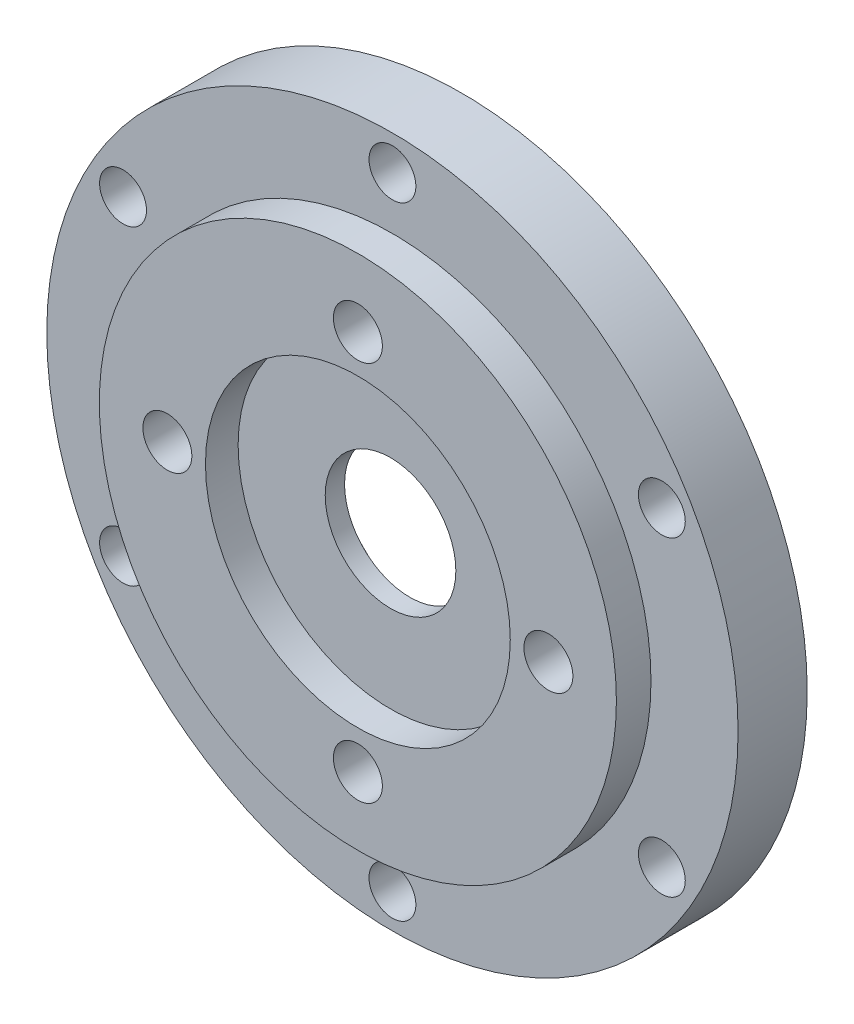
ISO-10303-21;
HEADER;
FILE_DESCRIPTION(('STEP AP214'),'2;1');
FILE_NAME('part.step','',(''),(''),'','','');
FILE_SCHEMA(('AUTOMOTIVE_DESIGN { 1 0 10303 214 1 1 1 1 }'));
ENDSEC;
DATA;
#1=APPLICATION_CONTEXT('core data for automotive mechanical design processes');
#2=APPLICATION_PROTOCOL_DEFINITION('international standard','automotive_design',2000,#1);
#3=PRODUCT_CONTEXT('',#1,'mechanical');
#4=PRODUCT('Part','Part','',(#3));
#5=PRODUCT_RELATED_PRODUCT_CATEGORY('part','',(#4));
#6=PRODUCT_DEFINITION_FORMATION('','',#4);
#7=PRODUCT_DEFINITION_CONTEXT('part definition',#1,'design');
#8=PRODUCT_DEFINITION('design','',#6,#7);
#9=PRODUCT_DEFINITION_SHAPE('','',#8);
#10=(LENGTH_UNIT() NAMED_UNIT(*) SI_UNIT(.MILLI.,.METRE.));
#11=(NAMED_UNIT(*) PLANE_ANGLE_UNIT() SI_UNIT($,.RADIAN.));
#12=(NAMED_UNIT(*) SI_UNIT($,.STERADIAN.) SOLID_ANGLE_UNIT());
#13=UNCERTAINTY_MEASURE_WITH_UNIT(LENGTH_MEASURE(1.E-05),#10,'distance_accuracy_value','');
#14=(GEOMETRIC_REPRESENTATION_CONTEXT(3) GLOBAL_UNCERTAINTY_ASSIGNED_CONTEXT((#13)) GLOBAL_UNIT_ASSIGNED_CONTEXT((#10,
#11,#12)) REPRESENTATION_CONTEXT('',''));
#15=CARTESIAN_POINT('',(0.,0.,0.));
#16=DIRECTION('',(0.,0.,1.));
#17=DIRECTION('',(1.,0.,0.));
#18=AXIS2_PLACEMENT_3D('',#15,#16,#17);
#19=CARTESIAN_POINT('',(0.,0.,9.525));
#20=DIRECTION('',(0.,0.,-1.));
#21=DIRECTION('',(-1.,0.,0.));
#22=AXIS2_PLACEMENT_3D('',#19,#20,#21);
#23=CYLINDRICAL_SURFACE('',#22,31.75);
#24=CARTESIAN_POINT('',(0.,0.,0.));
#25=DIRECTION('',(0.,0.,1.));
#26=DIRECTION('',(1.,0.,0.));
#27=AXIS2_PLACEMENT_3D('',#24,#25,#26);
#28=CIRCLE('',#27,31.75);
#29=CARTESIAN_POINT('',(-31.75,0.,0.));
#30=VERTEX_POINT('',#29);
#31=EDGE_CURVE('E11',#30,#30,#28,.T.);
#32=CARTESIAN_POINT('',(0.,0.,6.35));
#33=DIRECTION('',(0.,0.,1.));
#34=DIRECTION('',(1.,0.,0.));
#35=AXIS2_PLACEMENT_3D('',#32,#33,#34);
#36=CIRCLE('',#35,31.75);
#37=CARTESIAN_POINT('',(-31.75,0.,6.35));
#38=VERTEX_POINT('',#37);
#39=EDGE_CURVE('E125',#38,#38,#36,.T.);
#40=CARTESIAN_POINT('',(-31.75,0.,0.));
#41=CARTESIAN_POINT('',(-31.75,0.,0.0661458333333336));
#42=CARTESIAN_POINT('',(-31.75,0.,0.132291666666667));
#43=CARTESIAN_POINT('',(-31.75,0.,0.264583333333334));
#44=CARTESIAN_POINT('',(-31.75,0.,0.330729166666667));
#45=CARTESIAN_POINT('',(-31.75,0.,0.463020833333333));
#46=CARTESIAN_POINT('',(-31.75,0.,0.529166666666667));
#47=CARTESIAN_POINT('',(-31.75,0.,0.661458333333333));
#48=CARTESIAN_POINT('',(-31.75,0.,0.727604166666666));
#49=CARTESIAN_POINT('',(-31.75,0.,0.859895833333333));
#50=CARTESIAN_POINT('',(-31.75,0.,0.926041666666666));
#51=CARTESIAN_POINT('',(-31.75,0.,1.05833333333333));
#52=CARTESIAN_POINT('',(-31.75,0.,1.12447916666667));
#53=CARTESIAN_POINT('',(-31.75,0.,1.25677083333333));
#54=CARTESIAN_POINT('',(-31.75,0.,1.32291666666667));
#55=CARTESIAN_POINT('',(-31.75,0.,1.45520833333333));
#56=CARTESIAN_POINT('',(-31.75,0.,1.52135416666667));
#57=CARTESIAN_POINT('',(-31.75,0.,1.65364583333333));
#58=CARTESIAN_POINT('',(-31.75,0.,1.71979166666667));
#59=CARTESIAN_POINT('',(-31.75,0.,1.85208333333333));
#60=CARTESIAN_POINT('',(-31.75,0.,1.91822916666667));
#61=CARTESIAN_POINT('',(-31.75,0.,2.05052083333333));
#62=CARTESIAN_POINT('',(-31.75,0.,2.11666666666667));
#63=CARTESIAN_POINT('',(-31.75,0.,2.24895833333333));
#64=CARTESIAN_POINT('',(-31.75,0.,2.31510416666667));
#65=CARTESIAN_POINT('',(-31.75,0.,2.44739583333333));
#66=CARTESIAN_POINT('',(-31.75,0.,2.51354166666667));
#67=CARTESIAN_POINT('',(-31.75,0.,2.64583333333333));
#68=CARTESIAN_POINT('',(-31.75,0.,2.71197916666667));
#69=CARTESIAN_POINT('',(-31.75,0.,2.84427083333333));
#70=CARTESIAN_POINT('',(-31.75,0.,2.91041666666667));
#71=CARTESIAN_POINT('',(-31.75,0.,3.04270833333333));
#72=CARTESIAN_POINT('',(-31.75,0.,3.10885416666667));
#73=CARTESIAN_POINT('',(-31.75,0.,3.24114583333333));
#74=CARTESIAN_POINT('',(-31.75,0.,3.30729166666667));
#75=CARTESIAN_POINT('',(-31.75,0.,3.43958333333333));
#76=CARTESIAN_POINT('',(-31.75,0.,3.50572916666667));
#77=CARTESIAN_POINT('',(-31.75,0.,3.63802083333333));
#78=CARTESIAN_POINT('',(-31.75,0.,3.70416666666667));
#79=CARTESIAN_POINT('',(-31.75,0.,3.83645833333333));
#80=CARTESIAN_POINT('',(-31.75,0.,3.90260416666667));
#81=CARTESIAN_POINT('',(-31.75,0.,4.03489583333333));
#82=CARTESIAN_POINT('',(-31.75,0.,4.10104166666667));
#83=CARTESIAN_POINT('',(-31.75,0.,4.23333333333333));
#84=CARTESIAN_POINT('',(-31.75,0.,4.29947916666667));
#85=CARTESIAN_POINT('',(-31.75,0.,4.43177083333333));
#86=CARTESIAN_POINT('',(-31.75,0.,4.49791666666667));
#87=CARTESIAN_POINT('',(-31.75,0.,4.63020833333333));
#88=CARTESIAN_POINT('',(-31.75,0.,4.69635416666667));
#89=CARTESIAN_POINT('',(-31.75,0.,4.82864583333333));
#90=CARTESIAN_POINT('',(-31.75,0.,4.89479166666667));
#91=CARTESIAN_POINT('',(-31.75,0.,5.02708333333333));
#92=CARTESIAN_POINT('',(-31.75,0.,5.09322916666667));
#93=CARTESIAN_POINT('',(-31.75,0.,5.22552083333333));
#94=CARTESIAN_POINT('',(-31.75,0.,5.29166666666667));
#95=CARTESIAN_POINT('',(-31.75,0.,5.42395833333333));
#96=CARTESIAN_POINT('',(-31.75,0.,5.49010416666667));
#97=CARTESIAN_POINT('',(-31.75,0.,5.62239583333333));
#98=CARTESIAN_POINT('',(-31.75,0.,5.68854166666667));
#99=CARTESIAN_POINT('',(-31.75,0.,5.82083333333333));
#100=CARTESIAN_POINT('',(-31.75,0.,5.88697916666667));
#101=CARTESIAN_POINT('',(-31.75,0.,6.01927083333333));
#102=CARTESIAN_POINT('',(-31.75,0.,6.08541666666667));
#103=CARTESIAN_POINT('',(-31.75,0.,6.21770833333333));
#104=CARTESIAN_POINT('',(-31.75,0.,6.28385416666667));
#105=CARTESIAN_POINT('',(-31.75,0.,6.35));
#106=B_SPLINE_CURVE_WITH_KNOTS('',3,(#40,#41,#42,#43,#44,#45,#46,#47,#48,#49,#50,#51,#52,#53,
#54,#55,#56,#57,#58,#59,#60,#61,#62,#63,#64,#65,#66,#67,#68,#69,#70,#71,#72,#73,#74,#75,#76,#77,
#78,#79,#80,#81,#82,#83,#84,#85,#86,#87,#88,#89,#90,#91,#92,#93,#94,#95,#96,#97,#98,#99,#100,
#101,#102,#103,#104,#105),.UNSPECIFIED.,.F.,.F.,(4,2,2,2,2,2,2,2,2,2,2,2,2,2,2,2,2,2,2,2,2,2,2,
2,2,2,2,2,2,2,2,2,4),(0.,0.198437500000001,0.396875,0.5953125,0.793749999999999,0.9921875,
1.190625,1.3890625,1.5875,1.7859375,1.984375,2.1828125,2.38125,2.5796875,2.778125,2.9765625,
3.175,3.3734375,3.571875,3.7703125,3.96875,4.1671875,4.365625,4.5640625,4.7625,4.9609375,
5.159375,5.3578125,5.55625,5.7546875,5.953125,6.1515625,6.35),.UNSPECIFIED.);
#107=EDGE_CURVE('BSEAM31',#30,#38,#106,.T.);
#108=ORIENTED_EDGE('',*,*,#31,.T.);
#109=ORIENTED_EDGE('',*,*,#39,.F.);
#110=ORIENTED_EDGE('',*,*,#107,.T.);
#111=ORIENTED_EDGE('',*,*,#107,.F.);
#112=EDGE_LOOP('',(#108,#110,#109,#111));
#113=FACE_BOUND('',#112,.T.);
#114=ADVANCED_FACE('F31',(#113),#23,.T.);
#115=CARTESIAN_POINT('',(0.,0.,9.525));
#116=DIRECTION('',(0.,0.,1.));
#117=DIRECTION('',(1.,0.,0.));
#118=AXIS2_PLACEMENT_3D('',#115,#116,#117);
#119=PLANE('',#118);
#120=CARTESIAN_POINT('',(0.,0.,9.525));
#121=DIRECTION('',(0.,0.,1.));
#122=DIRECTION('',(1.,0.,0.));
#123=AXIS2_PLACEMENT_3D('',#120,#121,#122);
#124=CIRCLE('',#123,14.);
#125=CARTESIAN_POINT('',(14.,0.,9.525));
#126=VERTEX_POINT('',#125);
#127=EDGE_CURVE('E42',#126,#126,#124,.T.);
#128=ORIENTED_EDGE('',*,*,#127,.F.);
#129=EDGE_LOOP('',(#128));
#130=FACE_BOUND('',#129,.T.);
#131=CARTESIAN_POINT('',(17.5,1.83302876458243E-13,9.525));
#132=DIRECTION('',(0.,0.,-1.));
#133=DIRECTION('',(-1.,0.,0.));
#134=AXIS2_PLACEMENT_3D('',#131,#132,#133);
#135=CIRCLE('',#134,2.25);
#136=CARTESIAN_POINT('',(15.25,1.83302876458243E-13,9.525));
#137=VERTEX_POINT('',#136);
#138=EDGE_CURVE('E77',#137,#137,#135,.T.);
#139=ORIENTED_EDGE('',*,*,#138,.T.);
#140=EDGE_LOOP('',(#139));
#141=FACE_BOUND('',#140,.T.);
#142=CARTESIAN_POINT('',(1.22201917638828E-13,-17.5,9.525));
#143=DIRECTION('',(0.,0.,-1.));
#144=DIRECTION('',(-1.,0.,0.));
#145=AXIS2_PLACEMENT_3D('',#142,#143,#144);
#146=CIRCLE('',#145,2.25);
#147=CARTESIAN_POINT('',(-2.24999999999988,-17.5,9.525));
#148=VERTEX_POINT('',#147);
#149=EDGE_CURVE('E89',#148,#148,#146,.T.);
#150=ORIENTED_EDGE('',*,*,#149,.T.);
#151=EDGE_LOOP('',(#150));
#152=FACE_BOUND('',#151,.T.);
#153=CARTESIAN_POINT('',(-17.5,0.,9.525));
#154=DIRECTION('',(0.,0.,-1.));
#155=DIRECTION('',(-1.,0.,0.));
#156=AXIS2_PLACEMENT_3D('',#153,#154,#155);
#157=CIRCLE('',#156,2.25);
#158=CARTESIAN_POINT('',(-19.75,0.,9.525));
#159=VERTEX_POINT('',#158);
#160=EDGE_CURVE('E101',#159,#159,#157,.T.);
#161=ORIENTED_EDGE('',*,*,#160,.T.);
#162=EDGE_LOOP('',(#161));
#163=FACE_BOUND('',#162,.T.);
#164=CARTESIAN_POINT('',(0.,17.5,9.525));
#165=DIRECTION('',(0.,0.,-1.));
#166=DIRECTION('',(-1.,0.,0.));
#167=AXIS2_PLACEMENT_3D('',#164,#165,#166);
#168=CIRCLE('',#167,2.25);
#169=CARTESIAN_POINT('',(-2.25,17.5,9.525));
#170=VERTEX_POINT('',#169);
#171=EDGE_CURVE('E113',#170,#170,#168,.T.);
#172=ORIENTED_EDGE('',*,*,#171,.T.);
#173=EDGE_LOOP('',(#172));
#174=FACE_BOUND('',#173,.T.);
#175=CARTESIAN_POINT('',(0.,0.,9.525));
#176=DIRECTION('',(0.,0.,1.));
#177=DIRECTION('',(1.,0.,0.));
#178=AXIS2_PLACEMENT_3D('',#175,#176,#177);
#179=CIRCLE('',#178,23.749);
#180=CARTESIAN_POINT('',(23.749,0.,9.525));
#181=VERTEX_POINT('',#180);
#182=EDGE_CURVE('E143',#181,#181,#179,.T.);
#183=ORIENTED_EDGE('',*,*,#182,.T.);
#184=EDGE_LOOP('',(#183));
#185=FACE_BOUND('',#184,.T.);
#186=ADVANCED_FACE('F174',(#130,#141,#152,#163,#174,#185),#119,.T.);
#187=CARTESIAN_POINT('',(-24.7466759131402,14.2875000000003,9.525));
#188=DIRECTION('',(0.,0.,1.));
#189=DIRECTION('',(1.,0.,0.));
#190=AXIS2_PLACEMENT_3D('',#187,#188,#189);
#191=CYLINDRICAL_SURFACE('',#190,2.15264999999999);
#192=CARTESIAN_POINT('',(-24.7466759131402,14.2875000000003,0.));
#193=DIRECTION('',(0.,0.,1.));
#194=DIRECTION('',(1.,0.,0.));
#195=AXIS2_PLACEMENT_3D('',#192,#193,#194);
#196=CIRCLE('',#195,2.15265);
#197=CARTESIAN_POINT('',(-22.5940259131402,14.2875000000003,0.));
#198=VERTEX_POINT('',#197);
#199=EDGE_CURVE('E46',#198,#198,#196,.T.);
#200=ORIENTED_EDGE('',*,*,#199,.F.);
#201=EDGE_LOOP('',(#200));
#202=FACE_BOUND('',#201,.T.);
#203=CARTESIAN_POINT('',(-24.7466759131402,14.2875000000003,6.35));
#204=DIRECTION('',(0.,0.,1.));
#205=DIRECTION('',(1.,0.,0.));
#206=AXIS2_PLACEMENT_3D('',#203,#204,#205);
#207=CIRCLE('',#206,2.15264999999999);
#208=CARTESIAN_POINT('',(-22.5940259131402,14.2875000000003,6.35));
#209=VERTEX_POINT('',#208);
#210=EDGE_CURVE('E128',#209,#209,#207,.F.);
#211=ORIENTED_EDGE('',*,*,#210,.F.);
#212=EDGE_LOOP('',(#211));
#213=FACE_BOUND('',#212,.T.);
#214=ADVANCED_FACE('F178',(#202,#213),#191,.F.);
#215=CARTESIAN_POINT('',(-24.7466759131405,-14.2874999999998,9.525));
#216=DIRECTION('',(0.,0.,1.));
#217=DIRECTION('',(1.,0.,0.));
#218=AXIS2_PLACEMENT_3D('',#215,#216,#217);
#219=CYLINDRICAL_SURFACE('',#218,2.15264999999999);
#220=CARTESIAN_POINT('',(-24.7466759131405,-14.2874999999998,0.));
#221=DIRECTION('',(0.,0.,1.));
#222=DIRECTION('',(1.,0.,0.));
#223=AXIS2_PLACEMENT_3D('',#220,#221,#222);
#224=CIRCLE('',#223,2.15265);
#225=CARTESIAN_POINT('',(-22.5940259131405,-14.2874999999998,0.));
#226=VERTEX_POINT('',#225);
#227=EDGE_CURVE('E50',#226,#226,#224,.T.);
#228=ORIENTED_EDGE('',*,*,#227,.F.);
#229=EDGE_LOOP('',(#228));
#230=FACE_BOUND('',#229,.T.);
#231=CARTESIAN_POINT('',(-24.7466759131405,-14.2874999999998,6.35));
#232=DIRECTION('',(0.,0.,1.));
#233=DIRECTION('',(1.,0.,0.));
#234=AXIS2_PLACEMENT_3D('',#231,#232,#233);
#235=CIRCLE('',#234,2.15264999999999);
#236=CARTESIAN_POINT('',(-22.5940259131405,-14.2874999999998,6.35));
#237=VERTEX_POINT('',#236);
#238=EDGE_CURVE('E131',#237,#237,#235,.F.);
#239=ORIENTED_EDGE('',*,*,#238,.F.);
#240=EDGE_LOOP('',(#239));
#241=FACE_BOUND('',#240,.T.);
#242=ADVANCED_FACE('F277',(#230,#241),#219,.F.);
#243=CARTESIAN_POINT('',(-1.99538274087401E-13,-28.575,9.525));
#244=DIRECTION('',(0.,0.,1.));
#245=DIRECTION('',(1.,0.,0.));
#246=AXIS2_PLACEMENT_3D('',#243,#244,#245);
#247=CYLINDRICAL_SURFACE('',#246,2.15264999999999);
#248=CARTESIAN_POINT('',(-1.99538274087401E-13,-28.575,0.));
#249=DIRECTION('',(0.,0.,1.));
#250=DIRECTION('',(1.,0.,0.));
#251=AXIS2_PLACEMENT_3D('',#248,#249,#250);
#252=CIRCLE('',#251,2.15265);
#253=CARTESIAN_POINT('',(2.1526499999998,-28.575,0.));
#254=VERTEX_POINT('',#253);
#255=EDGE_CURVE('E53',#254,#254,#252,.T.);
#256=ORIENTED_EDGE('',*,*,#255,.F.);
#257=EDGE_LOOP('',(#256));
#258=FACE_BOUND('',#257,.T.);
#259=CARTESIAN_POINT('',(-1.99538274087401E-13,-28.575,6.35));
#260=DIRECTION('',(0.,0.,1.));
#261=DIRECTION('',(1.,0.,0.));
#262=AXIS2_PLACEMENT_3D('',#259,#260,#261);
#263=CIRCLE('',#262,2.15264999999999);
#264=CARTESIAN_POINT('',(2.15264999999979,-28.575,6.35));
#265=VERTEX_POINT('',#264);
#266=EDGE_CURVE('E134',#265,#265,#263,.F.);
#267=ORIENTED_EDGE('',*,*,#266,.F.);
#268=EDGE_LOOP('',(#267));
#269=FACE_BOUND('',#268,.T.);
#270=ADVANCED_FACE('F283',(#258,#269),#247,.F.);
#271=CARTESIAN_POINT('',(24.7466759131403,-14.2875000000001,9.525));
#272=DIRECTION('',(0.,0.,1.));
#273=DIRECTION('',(1.,0.,0.));
#274=AXIS2_PLACEMENT_3D('',#271,#272,#273);
#275=CYLINDRICAL_SURFACE('',#274,2.15264999999999);
#276=CARTESIAN_POINT('',(24.7466759131403,-14.2875000000001,0.));
#277=DIRECTION('',(0.,0.,1.));
#278=DIRECTION('',(1.,0.,0.));
#279=AXIS2_PLACEMENT_3D('',#276,#277,#278);
#280=CIRCLE('',#279,2.15265);
#281=CARTESIAN_POINT('',(26.8993259131403,-14.2875000000001,0.));
#282=VERTEX_POINT('',#281);
#283=EDGE_CURVE('E56',#282,#282,#280,.T.);
#284=ORIENTED_EDGE('',*,*,#283,.F.);
#285=EDGE_LOOP('',(#284));
#286=FACE_BOUND('',#285,.T.);
#287=CARTESIAN_POINT('',(24.7466759131403,-14.2875000000001,6.35));
#288=DIRECTION('',(0.,0.,1.));
#289=DIRECTION('',(1.,0.,0.));
#290=AXIS2_PLACEMENT_3D('',#287,#288,#289);
#291=CIRCLE('',#290,2.15264999999999);
#292=CARTESIAN_POINT('',(26.8993259131403,-14.2875000000001,6.35));
#293=VERTEX_POINT('',#292);
#294=EDGE_CURVE('E137',#293,#293,#291,.F.);
#295=ORIENTED_EDGE('',*,*,#294,.F.);
#296=EDGE_LOOP('',(#295));
#297=FACE_BOUND('',#296,.T.);
#298=ADVANCED_FACE('F168',(#286,#297),#275,.F.);
#299=CARTESIAN_POINT('',(24.7466759131404,14.2874999999999,9.525));
#300=DIRECTION('',(0.,0.,1.));
#301=DIRECTION('',(1.,0.,0.));
#302=AXIS2_PLACEMENT_3D('',#299,#300,#301);
#303=CYLINDRICAL_SURFACE('',#302,2.15264999999999);
#304=CARTESIAN_POINT('',(24.7466759131404,14.2874999999999,0.));
#305=DIRECTION('',(0.,0.,1.));
#306=DIRECTION('',(1.,0.,0.));
#307=AXIS2_PLACEMENT_3D('',#304,#305,#306);
#308=CIRCLE('',#307,2.15265);
#309=CARTESIAN_POINT('',(26.8993259131404,14.2874999999999,0.));
#310=VERTEX_POINT('',#309);
#311=EDGE_CURVE('E59',#310,#310,#308,.T.);
#312=ORIENTED_EDGE('',*,*,#311,.F.);
#313=EDGE_LOOP('',(#312));
#314=FACE_BOUND('',#313,.T.);
#315=CARTESIAN_POINT('',(24.7466759131404,14.2874999999999,6.35));
#316=DIRECTION('',(0.,0.,1.));
#317=DIRECTION('',(1.,0.,0.));
#318=AXIS2_PLACEMENT_3D('',#315,#316,#317);
#319=CIRCLE('',#318,2.15264999999999);
#320=CARTESIAN_POINT('',(26.8993259131404,14.2874999999999,6.35));
#321=VERTEX_POINT('',#320);
#322=EDGE_CURVE('E140',#321,#321,#319,.F.);
#323=ORIENTED_EDGE('',*,*,#322,.F.);
#324=EDGE_LOOP('',(#323));
#325=FACE_BOUND('',#324,.T.);
#326=ADVANCED_FACE('F159',(#314,#325),#303,.F.);
#327=CARTESIAN_POINT('',(0.,28.575,9.525));
#328=DIRECTION('',(0.,0.,1.));
#329=DIRECTION('',(1.,0.,0.));
#330=AXIS2_PLACEMENT_3D('',#327,#328,#329);
#331=CYLINDRICAL_SURFACE('',#330,2.15264999999999);
#332=CARTESIAN_POINT('',(0.,28.575,0.));
#333=DIRECTION('',(0.,0.,1.));
#334=DIRECTION('',(1.,0.,0.));
#335=AXIS2_PLACEMENT_3D('',#332,#333,#334);
#336=CIRCLE('',#335,2.15265);
#337=CARTESIAN_POINT('',(2.15265,28.575,0.));
#338=VERTEX_POINT('',#337);
#339=EDGE_CURVE('E62',#338,#338,#336,.T.);
#340=ORIENTED_EDGE('',*,*,#339,.F.);
#341=EDGE_LOOP('',(#340));
#342=FACE_BOUND('',#341,.T.);
#343=CARTESIAN_POINT('',(0.,28.575,6.35));
#344=DIRECTION('',(0.,0.,1.));
#345=DIRECTION('',(1.,0.,0.));
#346=AXIS2_PLACEMENT_3D('',#343,#344,#345);
#347=CIRCLE('',#346,2.15264999999999);
#348=CARTESIAN_POINT('',(2.15264999999999,28.575,6.35));
#349=VERTEX_POINT('',#348);
#350=EDGE_CURVE('E34',#349,#349,#347,.F.);
#351=ORIENTED_EDGE('',*,*,#350,.F.);
#352=EDGE_LOOP('',(#351));
#353=FACE_BOUND('',#352,.T.);
#354=ADVANCED_FACE('F156',(#342,#353),#331,.F.);
#355=CARTESIAN_POINT('',(0.,0.,0.));
#356=DIRECTION('',(0.,0.,1.));
#357=DIRECTION('',(1.,0.,0.));
#358=AXIS2_PLACEMENT_3D('',#355,#356,#357);
#359=PLANE('',#358);
#360=CARTESIAN_POINT('',(0.,17.5,0.));
#361=DIRECTION('',(0.,0.,-1.));
#362=DIRECTION('',(-1.,0.,0.));
#363=AXIS2_PLACEMENT_3D('',#360,#361,#362);
#364=CIRCLE('',#363,4.);
#365=CARTESIAN_POINT('',(-4.,17.5,0.));
#366=VERTEX_POINT('',#365);
#367=EDGE_CURVE('E122',#366,#366,#364,.T.);
#368=ORIENTED_EDGE('',*,*,#367,.F.);
#369=EDGE_LOOP('',(#368));
#370=FACE_BOUND('',#369,.T.);
#371=CARTESIAN_POINT('',(-17.5,0.,0.));
#372=DIRECTION('',(0.,0.,-1.));
#373=DIRECTION('',(-1.,0.,0.));
#374=AXIS2_PLACEMENT_3D('',#371,#372,#373);
#375=CIRCLE('',#374,4.);
#376=CARTESIAN_POINT('',(-21.5,0.,0.));
#377=VERTEX_POINT('',#376);
#378=EDGE_CURVE('E110',#377,#377,#375,.T.);
#379=ORIENTED_EDGE('',*,*,#378,.F.);
#380=EDGE_LOOP('',(#379));
#381=FACE_BOUND('',#380,.T.);
#382=CARTESIAN_POINT('',(1.22201917638828E-13,-17.5,0.));
#383=DIRECTION('',(0.,0.,-1.));
#384=DIRECTION('',(-1.,0.,0.));
#385=AXIS2_PLACEMENT_3D('',#382,#383,#384);
#386=CIRCLE('',#385,4.);
#387=CARTESIAN_POINT('',(-3.99999999999988,-17.5,0.));
#388=VERTEX_POINT('',#387);
#389=EDGE_CURVE('E98',#388,#388,#386,.T.);
#390=ORIENTED_EDGE('',*,*,#389,.F.);
#391=EDGE_LOOP('',(#390));
#392=FACE_BOUND('',#391,.T.);
#393=CARTESIAN_POINT('',(17.5,1.83302876458243E-13,0.));
#394=DIRECTION('',(0.,0.,-1.));
#395=DIRECTION('',(-1.,0.,0.));
#396=AXIS2_PLACEMENT_3D('',#393,#394,#395);
#397=CIRCLE('',#396,4.);
#398=CARTESIAN_POINT('',(13.5,1.83302876458243E-13,0.));
#399=VERTEX_POINT('',#398);
#400=EDGE_CURVE('E86',#399,#399,#397,.T.);
#401=ORIENTED_EDGE('',*,*,#400,.F.);
#402=EDGE_LOOP('',(#401));
#403=FACE_BOUND('',#402,.T.);
#404=CARTESIAN_POINT('',(0.,0.,0.));
#405=DIRECTION('',(0.,0.,-1.));
#406=DIRECTION('',(-1.,0.,0.));
#407=AXIS2_PLACEMENT_3D('',#404,#405,#406);
#408=CIRCLE('',#407,12.7);
#409=CARTESIAN_POINT('',(-12.7,0.,0.));
#410=VERTEX_POINT('',#409);
#411=EDGE_CURVE('E66',#410,#410,#408,.T.);
#412=ORIENTED_EDGE('',*,*,#411,.F.);
#413=EDGE_LOOP('',(#412));
#414=FACE_BOUND('',#413,.T.);
#415=ORIENTED_EDGE('',*,*,#339,.T.);
#416=EDGE_LOOP('',(#415));
#417=FACE_BOUND('',#416,.T.);
#418=ORIENTED_EDGE('',*,*,#311,.T.);
#419=EDGE_LOOP('',(#418));
#420=FACE_BOUND('',#419,.T.);
#421=ORIENTED_EDGE('',*,*,#283,.T.);
#422=EDGE_LOOP('',(#421));
#423=FACE_BOUND('',#422,.T.);
#424=ORIENTED_EDGE('',*,*,#255,.T.);
#425=EDGE_LOOP('',(#424));
#426=FACE_BOUND('',#425,.T.);
#427=ORIENTED_EDGE('',*,*,#227,.T.);
#428=EDGE_LOOP('',(#427));
#429=FACE_BOUND('',#428,.T.);
#430=ORIENTED_EDGE('',*,*,#199,.T.);
#431=EDGE_LOOP('',(#430));
#432=FACE_BOUND('',#431,.T.);
#433=ORIENTED_EDGE('',*,*,#31,.F.);
#434=EDGE_LOOP('',(#433));
#435=FACE_BOUND('',#434,.T.);
#436=ADVANCED_FACE('F158',(#370,#381,#392,#403,#414,#417,#420,#423,#426,#429,#432,#435),#359,.F.);
#437=CARTESIAN_POINT('',(0.,0.,6.525));
#438=DIRECTION('',(0.,0.,1.));
#439=DIRECTION('',(1.,0.,0.));
#440=AXIS2_PLACEMENT_3D('',#437,#438,#439);
#441=CYLINDRICAL_SURFACE('',#440,14.);
#442=CARTESIAN_POINT('',(0.,0.,6.525));
#443=DIRECTION('',(0.,0.,1.));
#444=DIRECTION('',(1.,0.,0.));
#445=AXIS2_PLACEMENT_3D('',#442,#443,#444);
#446=CIRCLE('',#445,14.);
#447=CARTESIAN_POINT('',(14.,0.,6.525));
#448=VERTEX_POINT('',#447);
#449=EDGE_CURVE('E38',#448,#448,#446,.T.);
#450=ORIENTED_EDGE('',*,*,#449,.F.);
#451=EDGE_LOOP('',(#450));
#452=FACE_BOUND('',#451,.T.);
#453=ORIENTED_EDGE('',*,*,#127,.T.);
#454=EDGE_LOOP('',(#453));
#455=FACE_BOUND('',#454,.T.);
#456=ADVANCED_FACE('F166',(#452,#455),#441,.F.);
#457=CARTESIAN_POINT('',(0.,0.,6.525));
#458=DIRECTION('',(0.,0.,1.));
#459=DIRECTION('',(1.,0.,0.));
#460=AXIS2_PLACEMENT_3D('',#457,#458,#459);
#461=PLANE('',#460);
#462=CARTESIAN_POINT('',(0.,0.,6.525));
#463=DIRECTION('',(0.,0.,1.));
#464=DIRECTION('',(1.,0.,0.));
#465=AXIS2_PLACEMENT_3D('',#462,#463,#464);
#466=CIRCLE('',#465,6.);
#467=CARTESIAN_POINT('',(6.,0.,6.525));
#468=VERTEX_POINT('',#467);
#469=EDGE_CURVE('E69',#468,#468,#466,.T.);
#470=ORIENTED_EDGE('',*,*,#469,.F.);
#471=EDGE_LOOP('',(#470));
#472=FACE_BOUND('',#471,.T.);
#473=ORIENTED_EDGE('',*,*,#449,.T.);
#474=EDGE_LOOP('',(#473));
#475=FACE_BOUND('',#474,.T.);
#476=ADVANCED_FACE('F251',(#472,#475),#461,.T.);
#477=CARTESIAN_POINT('',(0.,0.,4.7498));
#478=DIRECTION('',(0.,0.,-1.));
#479=DIRECTION('',(-1.,0.,0.));
#480=AXIS2_PLACEMENT_3D('',#477,#478,#479);
#481=CYLINDRICAL_SURFACE('',#480,12.7);
#482=CARTESIAN_POINT('',(0.,0.,4.7498));
#483=DIRECTION('',(0.,0.,-1.));
#484=DIRECTION('',(-1.,0.,0.));
#485=AXIS2_PLACEMENT_3D('',#482,#483,#484);
#486=CIRCLE('',#485,12.7);
#487=CARTESIAN_POINT('',(-12.7,0.,4.7498));
#488=VERTEX_POINT('',#487);
#489=EDGE_CURVE('E65',#488,#488,#486,.T.);
#490=ORIENTED_EDGE('',*,*,#489,.F.);
#491=EDGE_LOOP('',(#490));
#492=FACE_BOUND('',#491,.T.);
#493=ORIENTED_EDGE('',*,*,#411,.T.);
#494=EDGE_LOOP('',(#493));
#495=FACE_BOUND('',#494,.T.);
#496=ADVANCED_FACE('F248',(#492,#495),#481,.F.);
#497=CARTESIAN_POINT('',(0.,0.,4.7498));
#498=DIRECTION('',(0.,0.,-1.));
#499=DIRECTION('',(-1.,0.,0.));
#500=AXIS2_PLACEMENT_3D('',#497,#498,#499);
#501=PLANE('',#500);
#502=CARTESIAN_POINT('',(0.,0.,4.7498));
#503=DIRECTION('',(0.,0.,-1.));
#504=DIRECTION('',(-1.,0.,0.));
#505=AXIS2_PLACEMENT_3D('',#502,#503,#504);
#506=CIRCLE('',#505,6.);
#507=CARTESIAN_POINT('',(-6.,0.,4.7498));
#508=VERTEX_POINT('',#507);
#509=EDGE_CURVE('E74',#508,#508,#506,.T.);
#510=ORIENTED_EDGE('',*,*,#509,.F.);
#511=EDGE_LOOP('',(#510));
#512=FACE_BOUND('',#511,.T.);
#513=ORIENTED_EDGE('',*,*,#489,.T.);
#514=EDGE_LOOP('',(#513));
#515=FACE_BOUND('',#514,.T.);
#516=ADVANCED_FACE('F245',(#512,#515),#501,.T.);
#517=CARTESIAN_POINT('',(0.,0.,9.525));
#518=DIRECTION('',(0.,0.,-1.));
#519=DIRECTION('',(-1.,0.,0.));
#520=AXIS2_PLACEMENT_3D('',#517,#518,#519);
#521=CYLINDRICAL_SURFACE('',#520,6.);
#522=ORIENTED_EDGE('',*,*,#469,.T.);
#523=EDGE_LOOP('',(#522));
#524=FACE_BOUND('',#523,.T.);
#525=ORIENTED_EDGE('',*,*,#509,.T.);
#526=EDGE_LOOP('',(#525));
#527=FACE_BOUND('',#526,.T.);
#528=ADVANCED_FACE('F241',(#524,#527),#521,.F.);
#529=CARTESIAN_POINT('',(17.5,1.83302876458243E-13,0.));
#530=DIRECTION('',(0.,0.,-1.));
#531=DIRECTION('',(-1.,0.,0.));
#532=AXIS2_PLACEMENT_3D('',#529,#530,#531);
#533=CYLINDRICAL_SURFACE('',#532,2.25);
#534=ORIENTED_EDGE('',*,*,#138,.F.);
#535=EDGE_LOOP('',(#534));
#536=FACE_BOUND('',#535,.T.);
#537=CARTESIAN_POINT('',(17.5,1.83302876458243E-13,4.));
#538=DIRECTION('',(0.,0.,-1.));
#539=DIRECTION('',(-1.,0.,0.));
#540=AXIS2_PLACEMENT_3D('',#537,#538,#539);
#541=CIRCLE('',#540,2.25);
#542=CARTESIAN_POINT('',(15.25,1.83302876458243E-13,4.));
#543=VERTEX_POINT('',#542);
#544=EDGE_CURVE('E80',#543,#543,#541,.T.);
#545=ORIENTED_EDGE('',*,*,#544,.T.);
#546=EDGE_LOOP('',(#545));
#547=FACE_BOUND('',#546,.T.);
#548=ADVANCED_FACE('F237',(#536,#547),#533,.F.);
#549=CARTESIAN_POINT('',(19.75,1.83302876458243E-13,4.));
#550=DIRECTION('',(0.,0.,1.));
#551=DIRECTION('',(1.,0.,0.));
#552=AXIS2_PLACEMENT_3D('',#549,#550,#551);
#553=PLANE('',#552);
#554=ORIENTED_EDGE('',*,*,#544,.F.);
#555=EDGE_LOOP('',(#554));
#556=FACE_BOUND('',#555,.T.);
#557=CARTESIAN_POINT('',(17.5,1.83302876458243E-13,4.));
#558=DIRECTION('',(0.,0.,-1.));
#559=DIRECTION('',(-1.,0.,0.));
#560=AXIS2_PLACEMENT_3D('',#557,#558,#559);
#561=CIRCLE('',#560,4.);
#562=CARTESIAN_POINT('',(13.5,1.83302876458243E-13,4.));
#563=VERTEX_POINT('',#562);
#564=EDGE_CURVE('E83',#563,#563,#561,.T.);
#565=ORIENTED_EDGE('',*,*,#564,.T.);
#566=EDGE_LOOP('',(#565));
#567=FACE_BOUND('',#566,.T.);
#568=ADVANCED_FACE('F233',(#556,#567),#553,.F.);
#569=CARTESIAN_POINT('',(17.5,1.83302876458243E-13,0.));
#570=DIRECTION('',(0.,0.,-1.));
#571=DIRECTION('',(-1.,0.,0.));
#572=AXIS2_PLACEMENT_3D('',#569,#570,#571);
#573=CYLINDRICAL_SURFACE('',#572,4.);
#574=ORIENTED_EDGE('',*,*,#564,.F.);
#575=EDGE_LOOP('',(#574));
#576=FACE_BOUND('',#575,.T.);
#577=ORIENTED_EDGE('',*,*,#400,.T.);
#578=EDGE_LOOP('',(#577));
#579=FACE_BOUND('',#578,.T.);
#580=ADVANCED_FACE('F229',(#576,#579),#573,.F.);
#581=CARTESIAN_POINT('',(1.22201917638828E-13,-17.5,0.));
#582=DIRECTION('',(0.,0.,-1.));
#583=DIRECTION('',(-1.,0.,0.));
#584=AXIS2_PLACEMENT_3D('',#581,#582,#583);
#585=CYLINDRICAL_SURFACE('',#584,2.25);
#586=ORIENTED_EDGE('',*,*,#149,.F.);
#587=EDGE_LOOP('',(#586));
#588=FACE_BOUND('',#587,.T.);
#589=CARTESIAN_POINT('',(1.22201917638828E-13,-17.5,4.));
#590=DIRECTION('',(0.,0.,-1.));
#591=DIRECTION('',(-1.,0.,0.));
#592=AXIS2_PLACEMENT_3D('',#589,#590,#591);
#593=CIRCLE('',#592,2.25);
#594=CARTESIAN_POINT('',(-2.24999999999988,-17.5,4.));
#595=VERTEX_POINT('',#594);
#596=EDGE_CURVE('E92',#595,#595,#593,.T.);
#597=ORIENTED_EDGE('',*,*,#596,.T.);
#598=EDGE_LOOP('',(#597));
#599=FACE_BOUND('',#598,.T.);
#600=ADVANCED_FACE('F225',(#588,#599),#585,.F.);
#601=CARTESIAN_POINT('',(2.25000000000012,-17.5,4.));
#602=DIRECTION('',(0.,0.,1.));
#603=DIRECTION('',(1.,0.,0.));
#604=AXIS2_PLACEMENT_3D('',#601,#602,#603);
#605=PLANE('',#604);
#606=ORIENTED_EDGE('',*,*,#596,.F.);
#607=EDGE_LOOP('',(#606));
#608=FACE_BOUND('',#607,.T.);
#609=CARTESIAN_POINT('',(1.22201917638828E-13,-17.5,4.));
#610=DIRECTION('',(0.,0.,-1.));
#611=DIRECTION('',(-1.,0.,0.));
#612=AXIS2_PLACEMENT_3D('',#609,#610,#611);
#613=CIRCLE('',#612,4.);
#614=CARTESIAN_POINT('',(-3.99999999999988,-17.5,4.));
#615=VERTEX_POINT('',#614);
#616=EDGE_CURVE('E95',#615,#615,#613,.T.);
#617=ORIENTED_EDGE('',*,*,#616,.T.);
#618=EDGE_LOOP('',(#617));
#619=FACE_BOUND('',#618,.T.);
#620=ADVANCED_FACE('F221',(#608,#619),#605,.F.);
#621=CARTESIAN_POINT('',(1.22201917638828E-13,-17.5,0.));
#622=DIRECTION('',(0.,0.,-1.));
#623=DIRECTION('',(-1.,0.,0.));
#624=AXIS2_PLACEMENT_3D('',#621,#622,#623);
#625=CYLINDRICAL_SURFACE('',#624,4.);
#626=ORIENTED_EDGE('',*,*,#616,.F.);
#627=EDGE_LOOP('',(#626));
#628=FACE_BOUND('',#627,.T.);
#629=ORIENTED_EDGE('',*,*,#389,.T.);
#630=EDGE_LOOP('',(#629));
#631=FACE_BOUND('',#630,.T.);
#632=ADVANCED_FACE('F217',(#628,#631),#625,.F.);
#633=CARTESIAN_POINT('',(-17.5,0.,0.));
#634=DIRECTION('',(0.,0.,-1.));
#635=DIRECTION('',(-1.,0.,0.));
#636=AXIS2_PLACEMENT_3D('',#633,#634,#635);
#637=CYLINDRICAL_SURFACE('',#636,2.25);
#638=ORIENTED_EDGE('',*,*,#160,.F.);
#639=EDGE_LOOP('',(#638));
#640=FACE_BOUND('',#639,.T.);
#641=CARTESIAN_POINT('',(-17.5,0.,4.));
#642=DIRECTION('',(0.,0.,-1.));
#643=DIRECTION('',(-1.,0.,0.));
#644=AXIS2_PLACEMENT_3D('',#641,#642,#643);
#645=CIRCLE('',#644,2.25);
#646=CARTESIAN_POINT('',(-19.75,0.,4.));
#647=VERTEX_POINT('',#646);
#648=EDGE_CURVE('E104',#647,#647,#645,.T.);
#649=ORIENTED_EDGE('',*,*,#648,.T.);
#650=EDGE_LOOP('',(#649));
#651=FACE_BOUND('',#650,.T.);
#652=ADVANCED_FACE('F213',(#640,#651),#637,.F.);
#653=CARTESIAN_POINT('',(-15.25,0.,4.));
#654=DIRECTION('',(0.,0.,1.));
#655=DIRECTION('',(1.,0.,0.));
#656=AXIS2_PLACEMENT_3D('',#653,#654,#655);
#657=PLANE('',#656);
#658=ORIENTED_EDGE('',*,*,#648,.F.);
#659=EDGE_LOOP('',(#658));
#660=FACE_BOUND('',#659,.T.);
#661=CARTESIAN_POINT('',(-17.5,0.,4.));
#662=DIRECTION('',(0.,0.,-1.));
#663=DIRECTION('',(-1.,0.,0.));
#664=AXIS2_PLACEMENT_3D('',#661,#662,#663);
#665=CIRCLE('',#664,4.);
#666=CARTESIAN_POINT('',(-21.5,0.,4.));
#667=VERTEX_POINT('',#666);
#668=EDGE_CURVE('E107',#667,#667,#665,.T.);
#669=ORIENTED_EDGE('',*,*,#668,.T.);
#670=EDGE_LOOP('',(#669));
#671=FACE_BOUND('',#670,.T.);
#672=ADVANCED_FACE('F209',(#660,#671),#657,.F.);
#673=CARTESIAN_POINT('',(-17.5,0.,0.));
#674=DIRECTION('',(0.,0.,-1.));
#675=DIRECTION('',(-1.,0.,0.));
#676=AXIS2_PLACEMENT_3D('',#673,#674,#675);
#677=CYLINDRICAL_SURFACE('',#676,4.);
#678=ORIENTED_EDGE('',*,*,#668,.F.);
#679=EDGE_LOOP('',(#678));
#680=FACE_BOUND('',#679,.T.);
#681=ORIENTED_EDGE('',*,*,#378,.T.);
#682=EDGE_LOOP('',(#681));
#683=FACE_BOUND('',#682,.T.);
#684=ADVANCED_FACE('F205',(#680,#683),#677,.F.);
#685=CARTESIAN_POINT('',(0.,17.5,0.));
#686=DIRECTION('',(0.,0.,-1.));
#687=DIRECTION('',(-1.,0.,0.));
#688=AXIS2_PLACEMENT_3D('',#685,#686,#687);
#689=CYLINDRICAL_SURFACE('',#688,2.25);
#690=ORIENTED_EDGE('',*,*,#171,.F.);
#691=EDGE_LOOP('',(#690));
#692=FACE_BOUND('',#691,.T.);
#693=CARTESIAN_POINT('',(0.,17.5,4.));
#694=DIRECTION('',(0.,0.,-1.));
#695=DIRECTION('',(-1.,0.,0.));
#696=AXIS2_PLACEMENT_3D('',#693,#694,#695);
#697=CIRCLE('',#696,2.25);
#698=CARTESIAN_POINT('',(-2.25,17.5,4.));
#699=VERTEX_POINT('',#698);
#700=EDGE_CURVE('E116',#699,#699,#697,.T.);
#701=ORIENTED_EDGE('',*,*,#700,.T.);
#702=EDGE_LOOP('',(#701));
#703=FACE_BOUND('',#702,.T.);
#704=ADVANCED_FACE('F201',(#692,#703),#689,.F.);
#705=CARTESIAN_POINT('',(2.25,17.5,4.));
#706=DIRECTION('',(0.,0.,1.));
#707=DIRECTION('',(1.,0.,0.));
#708=AXIS2_PLACEMENT_3D('',#705,#706,#707);
#709=PLANE('',#708);
#710=ORIENTED_EDGE('',*,*,#700,.F.);
#711=EDGE_LOOP('',(#710));
#712=FACE_BOUND('',#711,.T.);
#713=CARTESIAN_POINT('',(0.,17.5,4.));
#714=DIRECTION('',(0.,0.,-1.));
#715=DIRECTION('',(-1.,0.,0.));
#716=AXIS2_PLACEMENT_3D('',#713,#714,#715);
#717=CIRCLE('',#716,4.);
#718=CARTESIAN_POINT('',(-4.,17.5,4.));
#719=VERTEX_POINT('',#718);
#720=EDGE_CURVE('E119',#719,#719,#717,.T.);
#721=ORIENTED_EDGE('',*,*,#720,.T.);
#722=EDGE_LOOP('',(#721));
#723=FACE_BOUND('',#722,.T.);
#724=ADVANCED_FACE('F194',(#712,#723),#709,.F.);
#725=CARTESIAN_POINT('',(0.,17.5,0.));
#726=DIRECTION('',(0.,0.,-1.));
#727=DIRECTION('',(-1.,0.,0.));
#728=AXIS2_PLACEMENT_3D('',#725,#726,#727);
#729=CYLINDRICAL_SURFACE('',#728,4.);
#730=ORIENTED_EDGE('',*,*,#720,.F.);
#731=EDGE_LOOP('',(#730));
#732=FACE_BOUND('',#731,.T.);
#733=ORIENTED_EDGE('',*,*,#367,.T.);
#734=EDGE_LOOP('',(#733));
#735=FACE_BOUND('',#734,.T.);
#736=ADVANCED_FACE('F186',(#732,#735),#729,.F.);
#737=CARTESIAN_POINT('',(0.,0.,6.35));
#738=DIRECTION('',(0.,0.,1.));
#739=DIRECTION('',(1.,0.,0.));
#740=AXIS2_PLACEMENT_3D('',#737,#738,#739);
#741=PLANE('',#740);
#742=ORIENTED_EDGE('',*,*,#210,.T.);
#743=EDGE_LOOP('',(#742));
#744=FACE_BOUND('',#743,.T.);
#745=ORIENTED_EDGE('',*,*,#266,.T.);
#746=EDGE_LOOP('',(#745));
#747=FACE_BOUND('',#746,.T.);
#748=ORIENTED_EDGE('',*,*,#322,.T.);
#749=EDGE_LOOP('',(#748));
#750=FACE_BOUND('',#749,.T.);
#751=CARTESIAN_POINT('',(0.,0.,6.35));
#752=DIRECTION('',(0.,0.,1.));
#753=DIRECTION('',(1.,0.,0.));
#754=AXIS2_PLACEMENT_3D('',#751,#752,#753);
#755=CIRCLE('',#754,23.749);
#756=CARTESIAN_POINT('',(23.749,0.,6.35));
#757=VERTEX_POINT('',#756);
#758=EDGE_CURVE('E146',#757,#757,#755,.T.);
#759=ORIENTED_EDGE('',*,*,#758,.F.);
#760=EDGE_LOOP('',(#759));
#761=FACE_BOUND('',#760,.T.);
#762=ORIENTED_EDGE('',*,*,#350,.T.);
#763=EDGE_LOOP('',(#762));
#764=FACE_BOUND('',#763,.T.);
#765=ORIENTED_EDGE('',*,*,#294,.T.);
#766=EDGE_LOOP('',(#765));
#767=FACE_BOUND('',#766,.T.);
#768=ORIENTED_EDGE('',*,*,#238,.T.);
#769=EDGE_LOOP('',(#768));
#770=FACE_BOUND('',#769,.T.);
#771=ORIENTED_EDGE('',*,*,#39,.T.);
#772=EDGE_LOOP('',(#771));
#773=FACE_BOUND('',#772,.T.);
#774=ADVANCED_FACE('F153',(#744,#747,#750,#761,#764,#767,#770,#773),#741,.T.);
#775=CARTESIAN_POINT('',(0.,0.,6.35));
#776=DIRECTION('',(0.,0.,1.));
#777=DIRECTION('',(1.,0.,0.));
#778=AXIS2_PLACEMENT_3D('',#775,#776,#777);
#779=CYLINDRICAL_SURFACE('',#778,23.749);
#780=ORIENTED_EDGE('',*,*,#758,.T.);
#781=EDGE_LOOP('',(#780));
#782=FACE_BOUND('',#781,.T.);
#783=ORIENTED_EDGE('',*,*,#182,.F.);
#784=EDGE_LOOP('',(#783));
#785=FACE_BOUND('',#784,.T.);
#786=ADVANCED_FACE('F185',(#782,#785),#779,.T.);
#787=CLOSED_SHELL('',(#114,#186,#214,#242,#270,#298,#326,#354,#436,#456,#476,#496,#516,#528,
#548,#568,#580,#600,#620,#632,#652,#672,#684,#704,#724,#736,#774,#786));
#788=MANIFOLD_SOLID_BREP('B2',#787);
#789=ADVANCED_BREP_SHAPE_REPRESENTATION('',(#18,#788),#14);
#790=SHAPE_DEFINITION_REPRESENTATION(#9,#789);
ENDSEC;
END-ISO-10303-21;
